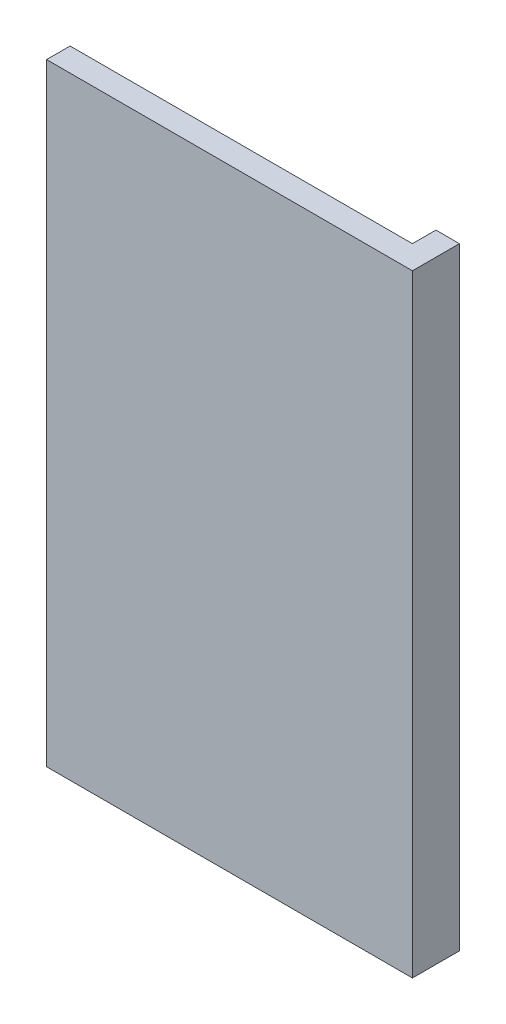
ISO-10303-21;
HEADER;
FILE_DESCRIPTION(('STEP AP214'),'2;1');
FILE_NAME('part.step','',(''),(''),'','','');
FILE_SCHEMA(('AUTOMOTIVE_DESIGN { 1 0 10303 214 1 1 1 1 }'));
ENDSEC;
DATA;
#1=APPLICATION_CONTEXT('core data for automotive mechanical design processes');
#2=APPLICATION_PROTOCOL_DEFINITION('international standard','automotive_design',2000,#1);
#3=PRODUCT_CONTEXT('',#1,'mechanical');
#4=PRODUCT('Part','Part','',(#3));
#5=PRODUCT_RELATED_PRODUCT_CATEGORY('part','',(#4));
#6=PRODUCT_DEFINITION_FORMATION('','',#4);
#7=PRODUCT_DEFINITION_CONTEXT('part definition',#1,'design');
#8=PRODUCT_DEFINITION('design','',#6,#7);
#9=PRODUCT_DEFINITION_SHAPE('','',#8);
#10=(LENGTH_UNIT() NAMED_UNIT(*) SI_UNIT(.MILLI.,.METRE.));
#11=(NAMED_UNIT(*) PLANE_ANGLE_UNIT() SI_UNIT($,.RADIAN.));
#12=(NAMED_UNIT(*) SI_UNIT($,.STERADIAN.) SOLID_ANGLE_UNIT());
#13=UNCERTAINTY_MEASURE_WITH_UNIT(LENGTH_MEASURE(1.E-05),#10,'distance_accuracy_value','');
#14=(GEOMETRIC_REPRESENTATION_CONTEXT(3) GLOBAL_UNCERTAINTY_ASSIGNED_CONTEXT((#13)) GLOBAL_UNIT_ASSIGNED_CONTEXT((#10,
#11,#12)) REPRESENTATION_CONTEXT('',''));
#15=CARTESIAN_POINT('',(0.,0.,0.));
#16=DIRECTION('',(0.,0.,1.));
#17=DIRECTION('',(1.,0.,0.));
#18=AXIS2_PLACEMENT_3D('',#15,#16,#17);
#19=CARTESIAN_POINT('',(0.,48.,2.));
#20=DIRECTION('',(0.,1.,0.));
#21=DIRECTION('',(0.,0.,1.));
#22=AXIS2_PLACEMENT_3D('',#19,#20,#21);
#23=PLANE('',#22);
#24=DIRECTION('',(1.,0.,0.));
#25=VECTOR('',#24,1.);
#26=CARTESIAN_POINT('',(0.,48.,0.));
#27=LINE('',#26,#25);
#28=CARTESIAN_POINT('',(-13.6180758017493,48.,0.));
#29=VERTEX_POINT('',#28);
#30=CARTESIAN_POINT('',(15.5319241982507,48.,0.));
#31=VERTEX_POINT('',#30);
#32=EDGE_CURVE('E124',#29,#31,#27,.T.);
#33=ORIENTED_EDGE('',*,*,#32,.F.);
#34=DIRECTION('',(0.,0.,-1.));
#35=VECTOR('',#34,1.);
#36=CARTESIAN_POINT('',(-13.6180758017493,48.,2.));
#37=LINE('',#36,#35);
#38=CARTESIAN_POINT('',(-13.6180758017493,48.,2.));
#39=VERTEX_POINT('',#38);
#40=EDGE_CURVE('E11',#39,#29,#37,.T.);
#41=ORIENTED_EDGE('',*,*,#40,.F.);
#42=DIRECTION('',(1.,0.,0.));
#43=VECTOR('',#42,1.);
#44=CARTESIAN_POINT('',(0.,48.,2.));
#45=LINE('',#44,#43);
#46=CARTESIAN_POINT('',(17.5319241982507,48.,2.));
#47=VERTEX_POINT('',#46);
#48=EDGE_CURVE('E104',#39,#47,#45,.T.);
#49=ORIENTED_EDGE('',*,*,#48,.T.);
#50=DIRECTION('',(0.,0.,-1.));
#51=VECTOR('',#50,1.);
#52=CARTESIAN_POINT('',(17.5319241982507,48.,2.));
#53=LINE('',#52,#51);
#54=CARTESIAN_POINT('',(17.5319241982507,48.,-2.));
#55=VERTEX_POINT('',#54);
#56=EDGE_CURVE('E64',#47,#55,#53,.T.);
#57=ORIENTED_EDGE('',*,*,#56,.T.);
#58=DIRECTION('',(1.,0.,0.));
#59=VECTOR('',#58,1.);
#60=CARTESIAN_POINT('',(0.,48.,-2.));
#61=LINE('',#60,#59);
#62=CARTESIAN_POINT('',(15.5319241982507,48.,-2.));
#63=VERTEX_POINT('',#62);
#64=EDGE_CURVE('E141',#63,#55,#61,.T.);
#65=ORIENTED_EDGE('',*,*,#64,.F.);
#66=DIRECTION('',(0.,0.,1.));
#67=VECTOR('',#66,1.);
#68=CARTESIAN_POINT('',(15.5319241982507,48.,-2.));
#69=LINE('',#68,#67);
#70=EDGE_CURVE('E158',#63,#31,#69,.T.);
#71=ORIENTED_EDGE('',*,*,#70,.T.);
#72=EDGE_LOOP('',(#33,#41,#49,#57,#65,#71));
#73=FACE_BOUND('',#72,.T.);
#74=ADVANCED_FACE('F41',(#73),#23,.T.);
#75=CARTESIAN_POINT('',(-13.6180758017493,0.,2.));
#76=DIRECTION('',(1.,0.,0.));
#77=DIRECTION('',(0.,0.,-1.));
#78=AXIS2_PLACEMENT_3D('',#75,#76,#77);
#79=PLANE('',#78);
#80=DIRECTION('',(0.,-1.,0.));
#81=VECTOR('',#80,1.);
#82=CARTESIAN_POINT('',(-13.6180758017493,0.,0.));
#83=LINE('',#82,#81);
#84=CARTESIAN_POINT('',(-13.6180758017493,-2.15,0.));
#85=VERTEX_POINT('',#84);
#86=EDGE_CURVE('E127',#29,#85,#83,.T.);
#87=ORIENTED_EDGE('',*,*,#86,.T.);
#88=DIRECTION('',(0.,0.,1.));
#89=VECTOR('',#88,1.);
#90=CARTESIAN_POINT('',(-13.6180758017493,-2.15,-2.));
#91=LINE('',#90,#89);
#92=CARTESIAN_POINT('',(-13.6180758017493,-2.15,-2.));
#93=VERTEX_POINT('',#92);
#94=EDGE_CURVE('E152',#93,#85,#91,.T.);
#95=ORIENTED_EDGE('',*,*,#94,.F.);
#96=DIRECTION('',(0.,-1.,0.));
#97=VECTOR('',#96,1.);
#98=CARTESIAN_POINT('',(-13.6180758017493,0.,-2.));
#99=LINE('',#98,#97);
#100=CARTESIAN_POINT('',(-13.6180758017493,-4.15,-2.));
#101=VERTEX_POINT('',#100);
#102=EDGE_CURVE('E112',#93,#101,#99,.T.);
#103=ORIENTED_EDGE('',*,*,#102,.T.);
#104=DIRECTION('',(0.,0.,-1.));
#105=VECTOR('',#104,1.);
#106=CARTESIAN_POINT('',(-13.6180758017493,-4.15,2.));
#107=LINE('',#106,#105);
#108=CARTESIAN_POINT('',(-13.6180758017493,-4.15,2.));
#109=VERTEX_POINT('',#108);
#110=EDGE_CURVE('E48',#109,#101,#107,.T.);
#111=ORIENTED_EDGE('',*,*,#110,.F.);
#112=DIRECTION('',(0.,-1.,0.));
#113=VECTOR('',#112,1.);
#114=CARTESIAN_POINT('',(-13.6180758017493,0.,2.));
#115=LINE('',#114,#113);
#116=EDGE_CURVE('E98',#39,#109,#115,.T.);
#117=ORIENTED_EDGE('',*,*,#116,.F.);
#118=ORIENTED_EDGE('',*,*,#40,.T.);
#119=EDGE_LOOP('',(#87,#95,#103,#111,#117,#118));
#120=FACE_BOUND('',#119,.T.);
#121=ADVANCED_FACE('F108',(#120),#79,.F.);
#122=CARTESIAN_POINT('',(0.,-4.15,2.));
#123=DIRECTION('',(0.,-1.,0.));
#124=DIRECTION('',(1.,0.,0.));
#125=AXIS2_PLACEMENT_3D('',#122,#123,#124);
#126=PLANE('',#125);
#127=ORIENTED_EDGE('',*,*,#110,.T.);
#128=DIRECTION('',(-1.,0.,0.));
#129=VECTOR('',#128,1.);
#130=CARTESIAN_POINT('',(0.,-4.15,-2.));
#131=LINE('',#130,#129);
#132=CARTESIAN_POINT('',(17.5319241982507,-4.15,-2.));
#133=VERTEX_POINT('',#132);
#134=EDGE_CURVE('E138',#133,#101,#131,.T.);
#135=ORIENTED_EDGE('',*,*,#134,.F.);
#136=DIRECTION('',(0.,0.,-1.));
#137=VECTOR('',#136,1.);
#138=CARTESIAN_POINT('',(17.5319241982507,-4.15,2.));
#139=LINE('',#138,#137);
#140=CARTESIAN_POINT('',(17.5319241982507,-4.15,2.));
#141=VERTEX_POINT('',#140);
#142=EDGE_CURVE('E116',#141,#133,#139,.T.);
#143=ORIENTED_EDGE('',*,*,#142,.F.);
#144=DIRECTION('',(-1.,0.,0.));
#145=VECTOR('',#144,1.);
#146=CARTESIAN_POINT('',(0.,-4.15,2.));
#147=LINE('',#146,#145);
#148=EDGE_CURVE('E103',#141,#109,#147,.T.);
#149=ORIENTED_EDGE('',*,*,#148,.T.);
#150=EDGE_LOOP('',(#127,#135,#143,#149));
#151=FACE_BOUND('',#150,.T.);
#152=ADVANCED_FACE('F117',(#151),#126,.T.);
#153=CARTESIAN_POINT('',(17.5319241982507,0.,2.));
#154=DIRECTION('',(1.,0.,0.));
#155=DIRECTION('',(0.,1.,0.));
#156=AXIS2_PLACEMENT_3D('',#153,#154,#155);
#157=PLANE('',#156);
#158=ORIENTED_EDGE('',*,*,#142,.T.);
#159=DIRECTION('',(0.,-1.,0.));
#160=VECTOR('',#159,1.);
#161=CARTESIAN_POINT('',(17.5319241982507,0.,-2.));
#162=LINE('',#161,#160);
#163=EDGE_CURVE('E133',#55,#133,#162,.T.);
#164=ORIENTED_EDGE('',*,*,#163,.F.);
#165=ORIENTED_EDGE('',*,*,#56,.F.);
#166=DIRECTION('',(0.,-1.,0.));
#167=VECTOR('',#166,1.);
#168=CARTESIAN_POINT('',(17.5319241982507,0.,2.));
#169=LINE('',#168,#167);
#170=EDGE_CURVE('E119',#47,#141,#169,.T.);
#171=ORIENTED_EDGE('',*,*,#170,.T.);
#172=EDGE_LOOP('',(#158,#164,#165,#171));
#173=FACE_BOUND('',#172,.T.);
#174=ADVANCED_FACE('F132',(#173),#157,.T.);
#175=CARTESIAN_POINT('',(0.,0.,2.));
#176=DIRECTION('',(0.,0.,1.));
#177=DIRECTION('',(1.,0.,0.));
#178=AXIS2_PLACEMENT_3D('',#175,#176,#177);
#179=PLANE('',#178);
#180=ORIENTED_EDGE('',*,*,#48,.F.);
#181=ORIENTED_EDGE('',*,*,#116,.T.);
#182=ORIENTED_EDGE('',*,*,#148,.F.);
#183=ORIENTED_EDGE('',*,*,#170,.F.);
#184=EDGE_LOOP('',(#180,#181,#182,#183));
#185=FACE_BOUND('',#184,.T.);
#186=ADVANCED_FACE('F100',(#185),#179,.T.);
#187=CARTESIAN_POINT('',(0.,0.,0.));
#188=DIRECTION('',(0.,0.,1.));
#189=DIRECTION('',(1.,0.,0.));
#190=AXIS2_PLACEMENT_3D('',#187,#188,#189);
#191=PLANE('',#190);
#192=DIRECTION('',(0.,-1.,0.));
#193=VECTOR('',#192,1.);
#194=CARTESIAN_POINT('',(15.5319241982507,0.,0.));
#195=LINE('',#194,#193);
#196=CARTESIAN_POINT('',(15.5319241982507,-2.14999999999999,0.));
#197=VERTEX_POINT('',#196);
#198=EDGE_CURVE('E154',#31,#197,#195,.T.);
#199=ORIENTED_EDGE('',*,*,#198,.T.);
#200=DIRECTION('',(-1.,0.,0.));
#201=VECTOR('',#200,1.);
#202=CARTESIAN_POINT('',(0.,-2.15,0.));
#203=LINE('',#202,#201);
#204=EDGE_CURVE('E55',#197,#85,#203,.T.);
#205=ORIENTED_EDGE('',*,*,#204,.T.);
#206=ORIENTED_EDGE('',*,*,#86,.F.);
#207=ORIENTED_EDGE('',*,*,#32,.T.);
#208=EDGE_LOOP('',(#199,#205,#206,#207));
#209=FACE_BOUND('',#208,.T.);
#210=ADVANCED_FACE('F164',(#209),#191,.F.);
#211=CARTESIAN_POINT('',(0.,-2.15,-2.));
#212=DIRECTION('',(0.,1.,0.));
#213=DIRECTION('',(-1.,0.,0.));
#214=AXIS2_PLACEMENT_3D('',#211,#212,#213);
#215=PLANE('',#214);
#216=ORIENTED_EDGE('',*,*,#204,.F.);
#217=DIRECTION('',(0.,0.,1.));
#218=VECTOR('',#217,1.);
#219=CARTESIAN_POINT('',(15.5319241982507,-2.14999999999999,-2.));
#220=LINE('',#219,#218);
#221=CARTESIAN_POINT('',(15.5319241982507,-2.14999999999999,-2.));
#222=VERTEX_POINT('',#221);
#223=EDGE_CURVE('E82',#222,#197,#220,.T.);
#224=ORIENTED_EDGE('',*,*,#223,.F.);
#225=DIRECTION('',(-1.,0.,0.));
#226=VECTOR('',#225,1.);
#227=CARTESIAN_POINT('',(0.,-2.15,-2.));
#228=LINE('',#227,#226);
#229=EDGE_CURVE('E144',#222,#93,#228,.T.);
#230=ORIENTED_EDGE('',*,*,#229,.T.);
#231=ORIENTED_EDGE('',*,*,#94,.T.);
#232=EDGE_LOOP('',(#216,#224,#230,#231));
#233=FACE_BOUND('',#232,.T.);
#234=ADVANCED_FACE('F166',(#233),#215,.T.);
#235=CARTESIAN_POINT('',(15.5319241982507,0.,-2.));
#236=DIRECTION('',(-1.,0.,0.));
#237=DIRECTION('',(0.,-1.,0.));
#238=AXIS2_PLACEMENT_3D('',#235,#236,#237);
#239=PLANE('',#238);
#240=ORIENTED_EDGE('',*,*,#198,.F.);
#241=ORIENTED_EDGE('',*,*,#70,.F.);
#242=DIRECTION('',(0.,-1.,0.));
#243=VECTOR('',#242,1.);
#244=CARTESIAN_POINT('',(15.5319241982507,0.,-2.));
#245=LINE('',#244,#243);
#246=EDGE_CURVE('E149',#63,#222,#245,.T.);
#247=ORIENTED_EDGE('',*,*,#246,.T.);
#248=ORIENTED_EDGE('',*,*,#223,.T.);
#249=EDGE_LOOP('',(#240,#241,#247,#248));
#250=FACE_BOUND('',#249,.T.);
#251=ADVANCED_FACE('F168',(#250),#239,.T.);
#252=CARTESIAN_POINT('',(0.,0.,-2.));
#253=DIRECTION('',(0.,0.,1.));
#254=DIRECTION('',(1.,0.,0.));
#255=AXIS2_PLACEMENT_3D('',#252,#253,#254);
#256=PLANE('',#255);
#257=ORIENTED_EDGE('',*,*,#229,.F.);
#258=ORIENTED_EDGE('',*,*,#246,.F.);
#259=ORIENTED_EDGE('',*,*,#64,.T.);
#260=ORIENTED_EDGE('',*,*,#163,.T.);
#261=ORIENTED_EDGE('',*,*,#134,.T.);
#262=ORIENTED_EDGE('',*,*,#102,.F.);
#263=EDGE_LOOP('',(#257,#258,#259,#260,#261,#262));
#264=FACE_BOUND('',#263,.T.);
#265=ADVANCED_FACE('F137',(#264),#256,.F.);
#266=CLOSED_SHELL('',(#74,#121,#152,#174,#186,#210,#234,#251,#265));
#267=MANIFOLD_SOLID_BREP('B2',#266);
#268=ADVANCED_BREP_SHAPE_REPRESENTATION('',(#18,#267),#14);
#269=SHAPE_DEFINITION_REPRESENTATION(#9,#268);
ENDSEC;
END-ISO-10303-21;
